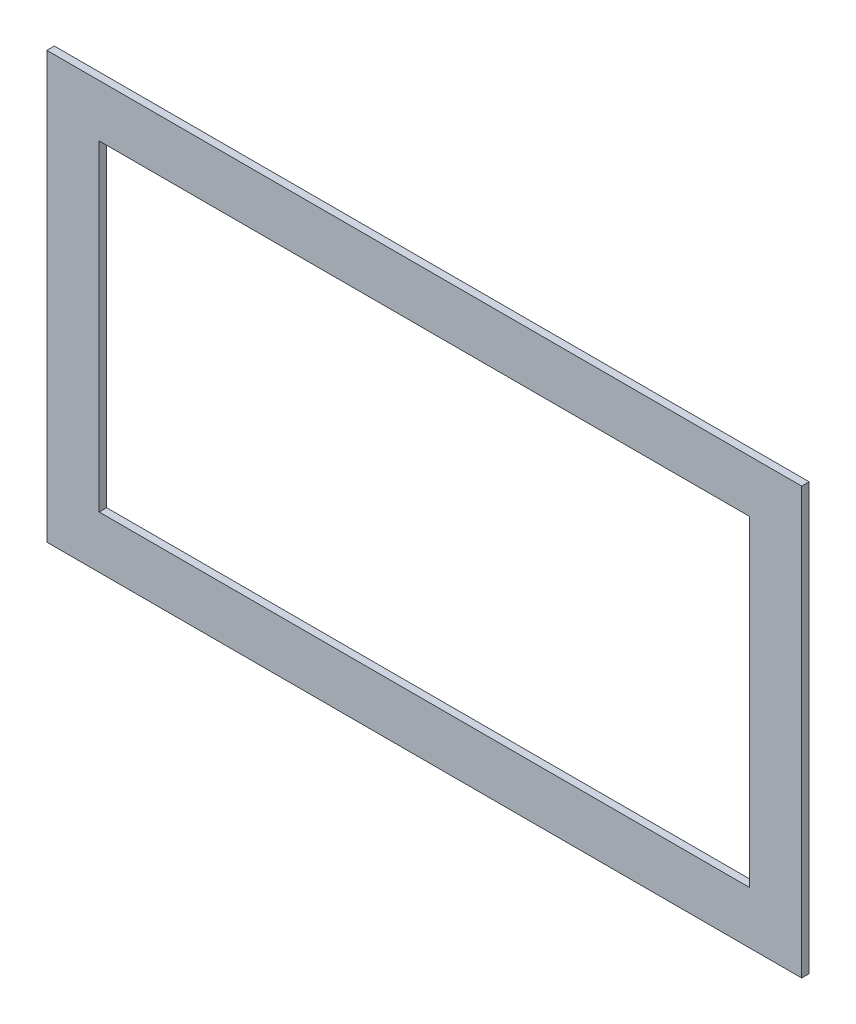
ISO-10303-21;
HEADER;
FILE_DESCRIPTION(('STEP AP214'),'2;1');
FILE_NAME('part.step','',(''),(''),'','','');
FILE_SCHEMA(('AUTOMOTIVE_DESIGN { 1 0 10303 214 1 1 1 1 }'));
ENDSEC;
DATA;
#1=APPLICATION_CONTEXT('core data for automotive mechanical design processes');
#2=APPLICATION_PROTOCOL_DEFINITION('international standard','automotive_design',2000,#1);
#3=PRODUCT_CONTEXT('',#1,'mechanical');
#4=PRODUCT('Part','Part','',(#3));
#5=PRODUCT_RELATED_PRODUCT_CATEGORY('part','',(#4));
#6=PRODUCT_DEFINITION_FORMATION('','',#4);
#7=PRODUCT_DEFINITION_CONTEXT('part definition',#1,'design');
#8=PRODUCT_DEFINITION('design','',#6,#7);
#9=PRODUCT_DEFINITION_SHAPE('','',#8);
#10=(LENGTH_UNIT() NAMED_UNIT(*) SI_UNIT(.MILLI.,.METRE.));
#11=(NAMED_UNIT(*) PLANE_ANGLE_UNIT() SI_UNIT($,.RADIAN.));
#12=(NAMED_UNIT(*) SI_UNIT($,.STERADIAN.) SOLID_ANGLE_UNIT());
#13=UNCERTAINTY_MEASURE_WITH_UNIT(LENGTH_MEASURE(1.E-05),#10,'distance_accuracy_value','');
#14=(GEOMETRIC_REPRESENTATION_CONTEXT(3) GLOBAL_UNCERTAINTY_ASSIGNED_CONTEXT((#13)) GLOBAL_UNIT_ASSIGNED_CONTEXT((#10,
#11,#12)) REPRESENTATION_CONTEXT('',''));
#15=CARTESIAN_POINT('',(0.,0.,0.));
#16=DIRECTION('',(0.,0.,1.));
#17=DIRECTION('',(1.,0.,0.));
#18=AXIS2_PLACEMENT_3D('',#15,#16,#17);
#19=CARTESIAN_POINT('',(0.,0.,1.));
#20=DIRECTION('',(0.,0.,-1.));
#21=DIRECTION('',(-1.,0.,0.));
#22=AXIS2_PLACEMENT_3D('',#19,#20,#21);
#23=PLANE('',#22);
#24=DIRECTION('',(0.,-1.,0.));
#25=VECTOR('',#24,1.);
#26=CARTESIAN_POINT('',(0.,0.,1.));
#27=LINE('',#26,#25);
#28=CARTESIAN_POINT('',(0.,57.,1.));
#29=VERTEX_POINT('',#28);
#30=CARTESIAN_POINT('',(0.,0.,1.));
#31=VERTEX_POINT('',#30);
#32=EDGE_CURVE('E139',#29,#31,#27,.T.);
#33=ORIENTED_EDGE('',*,*,#32,.T.);
#34=DIRECTION('',(1.,0.,0.));
#35=VECTOR('',#34,1.);
#36=CARTESIAN_POINT('',(0.,0.,1.));
#37=LINE('',#36,#35);
#38=CARTESIAN_POINT('',(101.,0.,1.));
#39=VERTEX_POINT('',#38);
#40=EDGE_CURVE('E142',#31,#39,#37,.T.);
#41=ORIENTED_EDGE('',*,*,#40,.T.);
#42=DIRECTION('',(0.,1.,0.));
#43=VECTOR('',#42,1.);
#44=CARTESIAN_POINT('',(101.,0.,1.));
#45=LINE('',#44,#43);
#46=CARTESIAN_POINT('',(101.,57.,1.));
#47=VERTEX_POINT('',#46);
#48=EDGE_CURVE('E147',#39,#47,#45,.T.);
#49=ORIENTED_EDGE('',*,*,#48,.T.);
#50=DIRECTION('',(-1.,0.,0.));
#51=VECTOR('',#50,1.);
#52=CARTESIAN_POINT('',(0.,57.,1.));
#53=LINE('',#52,#51);
#54=EDGE_CURVE('E149',#47,#29,#53,.T.);
#55=ORIENTED_EDGE('',*,*,#54,.T.);
#56=EDGE_LOOP('',(#33,#41,#49,#55));
#57=FACE_BOUND('',#56,.T.);
#58=DIRECTION('',(0.,-1.,0.));
#59=VECTOR('',#58,1.);
#60=CARTESIAN_POINT('',(7.,7.,1.));
#61=LINE('',#60,#59);
#62=CARTESIAN_POINT('',(7.,50.,1.));
#63=VERTEX_POINT('',#62);
#64=CARTESIAN_POINT('',(7.,7.,1.));
#65=VERTEX_POINT('',#64);
#66=EDGE_CURVE('E101',#63,#65,#61,.T.);
#67=ORIENTED_EDGE('',*,*,#66,.F.);
#68=DIRECTION('',(-1.,0.,0.));
#69=VECTOR('',#68,1.);
#70=CARTESIAN_POINT('',(7.,50.,1.));
#71=LINE('',#70,#69);
#72=CARTESIAN_POINT('',(94.,50.,1.));
#73=VERTEX_POINT('',#72);
#74=EDGE_CURVE('E128',#73,#63,#71,.T.);
#75=ORIENTED_EDGE('',*,*,#74,.F.);
#76=DIRECTION('',(0.,1.,0.));
#77=VECTOR('',#76,1.);
#78=CARTESIAN_POINT('',(94.,7.,1.));
#79=LINE('',#78,#77);
#80=CARTESIAN_POINT('',(94.,7.,1.));
#81=VERTEX_POINT('',#80);
#82=EDGE_CURVE('E125',#81,#73,#79,.T.);
#83=ORIENTED_EDGE('',*,*,#82,.F.);
#84=DIRECTION('',(1.,0.,0.));
#85=VECTOR('',#84,1.);
#86=CARTESIAN_POINT('',(7.,7.,1.));
#87=LINE('',#86,#85);
#88=EDGE_CURVE('E115',#65,#81,#87,.T.);
#89=ORIENTED_EDGE('',*,*,#88,.F.);
#90=EDGE_LOOP('',(#67,#75,#83,#89));
#91=FACE_BOUND('',#90,.T.);
#92=ADVANCED_FACE('F39',(#57,#91),#23,.F.);
#93=CARTESIAN_POINT('',(0.,0.,0.));
#94=DIRECTION('',(0.,0.,-1.));
#95=DIRECTION('',(-1.,0.,0.));
#96=AXIS2_PLACEMENT_3D('',#93,#94,#95);
#97=PLANE('',#96);
#98=DIRECTION('',(0.,-1.,0.));
#99=VECTOR('',#98,1.);
#100=CARTESIAN_POINT('',(0.,0.,0.));
#101=LINE('',#100,#99);
#102=CARTESIAN_POINT('',(0.,57.,0.));
#103=VERTEX_POINT('',#102);
#104=CARTESIAN_POINT('',(0.,0.,0.));
#105=VERTEX_POINT('',#104);
#106=EDGE_CURVE('E120',#103,#105,#101,.T.);
#107=ORIENTED_EDGE('',*,*,#106,.F.);
#108=DIRECTION('',(-1.,0.,0.));
#109=VECTOR('',#108,1.);
#110=CARTESIAN_POINT('',(0.,57.,0.));
#111=LINE('',#110,#109);
#112=CARTESIAN_POINT('',(101.,57.,0.));
#113=VERTEX_POINT('',#112);
#114=EDGE_CURVE('E143',#113,#103,#111,.T.);
#115=ORIENTED_EDGE('',*,*,#114,.F.);
#116=DIRECTION('',(0.,1.,0.));
#117=VECTOR('',#116,1.);
#118=CARTESIAN_POINT('',(101.,0.,0.));
#119=LINE('',#118,#117);
#120=CARTESIAN_POINT('',(101.,0.,0.));
#121=VERTEX_POINT('',#120);
#122=EDGE_CURVE('E155',#121,#113,#119,.T.);
#123=ORIENTED_EDGE('',*,*,#122,.F.);
#124=DIRECTION('',(1.,0.,0.));
#125=VECTOR('',#124,1.);
#126=CARTESIAN_POINT('',(0.,0.,0.));
#127=LINE('',#126,#125);
#128=EDGE_CURVE('E154',#105,#121,#127,.T.);
#129=ORIENTED_EDGE('',*,*,#128,.F.);
#130=EDGE_LOOP('',(#107,#115,#123,#129));
#131=FACE_BOUND('',#130,.T.);
#132=DIRECTION('',(-1.,0.,0.));
#133=VECTOR('',#132,1.);
#134=CARTESIAN_POINT('',(7.,50.,0.));
#135=LINE('',#134,#133);
#136=CARTESIAN_POINT('',(94.,50.,0.));
#137=VERTEX_POINT('',#136);
#138=CARTESIAN_POINT('',(7.,50.,0.));
#139=VERTEX_POINT('',#138);
#140=EDGE_CURVE('E111',#137,#139,#135,.T.);
#141=ORIENTED_EDGE('',*,*,#140,.T.);
#142=DIRECTION('',(0.,-1.,0.));
#143=VECTOR('',#142,1.);
#144=CARTESIAN_POINT('',(7.,7.,0.));
#145=LINE('',#144,#143);
#146=CARTESIAN_POINT('',(7.,7.,0.));
#147=VERTEX_POINT('',#146);
#148=EDGE_CURVE('E62',#139,#147,#145,.T.);
#149=ORIENTED_EDGE('',*,*,#148,.T.);
#150=DIRECTION('',(1.,0.,0.));
#151=VECTOR('',#150,1.);
#152=CARTESIAN_POINT('',(7.,7.,0.));
#153=LINE('',#152,#151);
#154=CARTESIAN_POINT('',(94.,7.,0.));
#155=VERTEX_POINT('',#154);
#156=EDGE_CURVE('E118',#147,#155,#153,.T.);
#157=ORIENTED_EDGE('',*,*,#156,.T.);
#158=DIRECTION('',(0.,1.,0.));
#159=VECTOR('',#158,1.);
#160=CARTESIAN_POINT('',(94.,7.,0.));
#161=LINE('',#160,#159);
#162=EDGE_CURVE('E135',#155,#137,#161,.T.);
#163=ORIENTED_EDGE('',*,*,#162,.T.);
#164=EDGE_LOOP('',(#141,#149,#157,#163));
#165=FACE_BOUND('',#164,.T.);
#166=ADVANCED_FACE('F171',(#131,#165),#97,.T.);
#167=CARTESIAN_POINT('',(0.,0.,1.));
#168=DIRECTION('',(1.,0.,0.));
#169=DIRECTION('',(0.,0.,-1.));
#170=AXIS2_PLACEMENT_3D('',#167,#168,#169);
#171=PLANE('',#170);
#172=ORIENTED_EDGE('',*,*,#106,.T.);
#173=DIRECTION('',(0.,0.,-1.));
#174=VECTOR('',#173,1.);
#175=CARTESIAN_POINT('',(0.,0.,1.));
#176=LINE('',#175,#174);
#177=EDGE_CURVE('E11',#31,#105,#176,.T.);
#178=ORIENTED_EDGE('',*,*,#177,.F.);
#179=ORIENTED_EDGE('',*,*,#32,.F.);
#180=DIRECTION('',(0.,0.,-1.));
#181=VECTOR('',#180,1.);
#182=CARTESIAN_POINT('',(0.,57.,1.));
#183=LINE('',#182,#181);
#184=EDGE_CURVE('E148',#29,#103,#183,.T.);
#185=ORIENTED_EDGE('',*,*,#184,.T.);
#186=EDGE_LOOP('',(#172,#178,#179,#185));
#187=FACE_BOUND('',#186,.T.);
#188=ADVANCED_FACE('F41',(#187),#171,.F.);
#189=CARTESIAN_POINT('',(0.,0.,1.));
#190=DIRECTION('',(0.,1.,0.));
#191=DIRECTION('',(0.,0.,1.));
#192=AXIS2_PLACEMENT_3D('',#189,#190,#191);
#193=PLANE('',#192);
#194=ORIENTED_EDGE('',*,*,#128,.T.);
#195=DIRECTION('',(0.,0.,-1.));
#196=VECTOR('',#195,1.);
#197=CARTESIAN_POINT('',(101.,0.,1.));
#198=LINE('',#197,#196);
#199=EDGE_CURVE('E50',#39,#121,#198,.T.);
#200=ORIENTED_EDGE('',*,*,#199,.F.);
#201=ORIENTED_EDGE('',*,*,#40,.F.);
#202=ORIENTED_EDGE('',*,*,#177,.T.);
#203=EDGE_LOOP('',(#194,#200,#201,#202));
#204=FACE_BOUND('',#203,.T.);
#205=ADVANCED_FACE('F183',(#204),#193,.F.);
#206=CARTESIAN_POINT('',(101.,0.,1.));
#207=DIRECTION('',(-1.,0.,0.));
#208=DIRECTION('',(0.,0.,1.));
#209=AXIS2_PLACEMENT_3D('',#206,#207,#208);
#210=PLANE('',#209);
#211=ORIENTED_EDGE('',*,*,#122,.T.);
#212=DIRECTION('',(0.,0.,-1.));
#213=VECTOR('',#212,1.);
#214=CARTESIAN_POINT('',(101.,57.,1.));
#215=LINE('',#214,#213);
#216=EDGE_CURVE('E158',#47,#113,#215,.T.);
#217=ORIENTED_EDGE('',*,*,#216,.F.);
#218=ORIENTED_EDGE('',*,*,#48,.F.);
#219=ORIENTED_EDGE('',*,*,#199,.T.);
#220=EDGE_LOOP('',(#211,#217,#218,#219));
#221=FACE_BOUND('',#220,.T.);
#222=ADVANCED_FACE('F167',(#221),#210,.F.);
#223=CARTESIAN_POINT('',(0.,57.,1.));
#224=DIRECTION('',(0.,-1.,0.));
#225=DIRECTION('',(0.,0.,-1.));
#226=AXIS2_PLACEMENT_3D('',#223,#224,#225);
#227=PLANE('',#226);
#228=ORIENTED_EDGE('',*,*,#114,.T.);
#229=ORIENTED_EDGE('',*,*,#184,.F.);
#230=ORIENTED_EDGE('',*,*,#54,.F.);
#231=ORIENTED_EDGE('',*,*,#216,.T.);
#232=EDGE_LOOP('',(#228,#229,#230,#231));
#233=FACE_BOUND('',#232,.T.);
#234=ADVANCED_FACE('F180',(#233),#227,.F.);
#235=CARTESIAN_POINT('',(7.,7.,1.));
#236=DIRECTION('',(1.,0.,0.));
#237=DIRECTION('',(0.,0.,-1.));
#238=AXIS2_PLACEMENT_3D('',#235,#236,#237);
#239=PLANE('',#238);
#240=ORIENTED_EDGE('',*,*,#148,.F.);
#241=DIRECTION('',(0.,0.,-1.));
#242=VECTOR('',#241,1.);
#243=CARTESIAN_POINT('',(7.,50.,1.));
#244=LINE('',#243,#242);
#245=EDGE_CURVE('E109',#63,#139,#244,.T.);
#246=ORIENTED_EDGE('',*,*,#245,.F.);
#247=ORIENTED_EDGE('',*,*,#66,.T.);
#248=DIRECTION('',(0.,0.,-1.));
#249=VECTOR('',#248,1.);
#250=CARTESIAN_POINT('',(7.,7.,1.));
#251=LINE('',#250,#249);
#252=EDGE_CURVE('E107',#65,#147,#251,.T.);
#253=ORIENTED_EDGE('',*,*,#252,.T.);
#254=EDGE_LOOP('',(#240,#246,#247,#253));
#255=FACE_BOUND('',#254,.T.);
#256=ADVANCED_FACE('F106',(#255),#239,.T.);
#257=CARTESIAN_POINT('',(7.,7.,1.));
#258=DIRECTION('',(0.,1.,0.));
#259=DIRECTION('',(0.,0.,1.));
#260=AXIS2_PLACEMENT_3D('',#257,#258,#259);
#261=PLANE('',#260);
#262=ORIENTED_EDGE('',*,*,#156,.F.);
#263=ORIENTED_EDGE('',*,*,#252,.F.);
#264=ORIENTED_EDGE('',*,*,#88,.T.);
#265=DIRECTION('',(0.,0.,-1.));
#266=VECTOR('',#265,1.);
#267=CARTESIAN_POINT('',(94.,7.,1.));
#268=LINE('',#267,#266);
#269=EDGE_CURVE('E123',#81,#155,#268,.T.);
#270=ORIENTED_EDGE('',*,*,#269,.T.);
#271=EDGE_LOOP('',(#262,#263,#264,#270));
#272=FACE_BOUND('',#271,.T.);
#273=ADVANCED_FACE('F116',(#272),#261,.T.);
#274=CARTESIAN_POINT('',(94.,7.,1.));
#275=DIRECTION('',(-1.,0.,0.));
#276=DIRECTION('',(0.,0.,1.));
#277=AXIS2_PLACEMENT_3D('',#274,#275,#276);
#278=PLANE('',#277);
#279=ORIENTED_EDGE('',*,*,#162,.F.);
#280=ORIENTED_EDGE('',*,*,#269,.F.);
#281=ORIENTED_EDGE('',*,*,#82,.T.);
#282=DIRECTION('',(0.,0.,-1.));
#283=VECTOR('',#282,1.);
#284=CARTESIAN_POINT('',(94.,50.,1.));
#285=LINE('',#284,#283);
#286=EDGE_CURVE('E53',#73,#137,#285,.T.);
#287=ORIENTED_EDGE('',*,*,#286,.T.);
#288=EDGE_LOOP('',(#279,#280,#281,#287));
#289=FACE_BOUND('',#288,.T.);
#290=ADVANCED_FACE('F206',(#289),#278,.T.);
#291=CARTESIAN_POINT('',(7.,50.,1.));
#292=DIRECTION('',(0.,-1.,0.));
#293=DIRECTION('',(0.,0.,-1.));
#294=AXIS2_PLACEMENT_3D('',#291,#292,#293);
#295=PLANE('',#294);
#296=ORIENTED_EDGE('',*,*,#140,.F.);
#297=ORIENTED_EDGE('',*,*,#286,.F.);
#298=ORIENTED_EDGE('',*,*,#74,.T.);
#299=ORIENTED_EDGE('',*,*,#245,.T.);
#300=EDGE_LOOP('',(#296,#297,#298,#299));
#301=FACE_BOUND('',#300,.T.);
#302=ADVANCED_FACE('F210',(#301),#295,.T.);
#303=CLOSED_SHELL('',(#92,#166,#188,#205,#222,#234,#256,#273,#290,#302));
#304=MANIFOLD_SOLID_BREP('B2',#303);
#305=ADVANCED_BREP_SHAPE_REPRESENTATION('',(#18,#304),#14);
#306=SHAPE_DEFINITION_REPRESENTATION(#9,#305);
ENDSEC;
END-ISO-10303-21;
